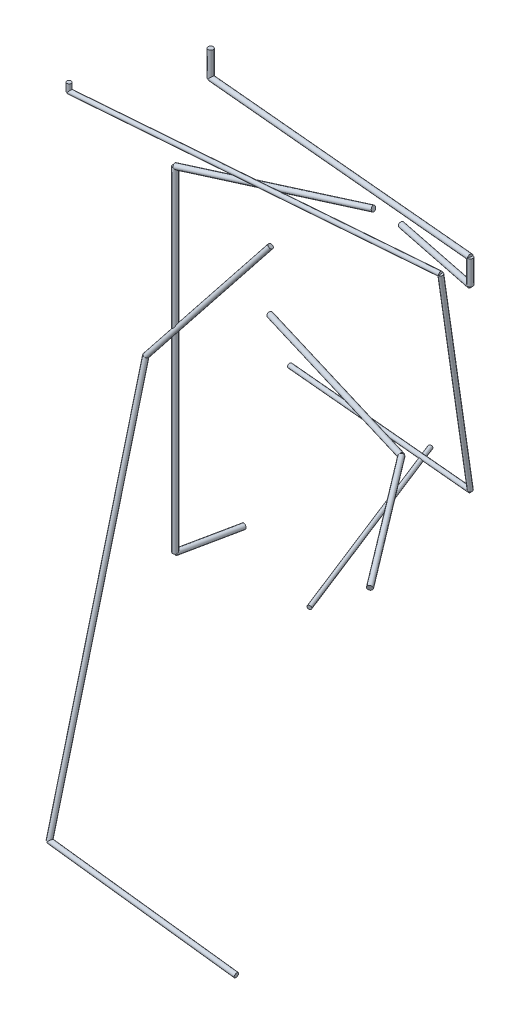
ISO-10303-21;
HEADER;
FILE_DESCRIPTION(('STEP AP214'),'2;1');
FILE_NAME('part.step','',(''),(''),'','','');
FILE_SCHEMA(('AUTOMOTIVE_DESIGN { 1 0 10303 214 1 1 1 1 }'));
ENDSEC;
DATA;
#1=APPLICATION_CONTEXT('core data for automotive mechanical design processes');
#2=APPLICATION_PROTOCOL_DEFINITION('international standard','automotive_design',2000,#1);
#3=PRODUCT_CONTEXT('',#1,'mechanical');
#4=PRODUCT('Part','Part','',(#3));
#5=PRODUCT_RELATED_PRODUCT_CATEGORY('part','',(#4));
#6=PRODUCT_DEFINITION_FORMATION('','',#4);
#7=PRODUCT_DEFINITION_CONTEXT('part definition',#1,'design');
#8=PRODUCT_DEFINITION('design','',#6,#7);
#9=PRODUCT_DEFINITION_SHAPE('','',#8);
#10=(LENGTH_UNIT() NAMED_UNIT(*) SI_UNIT(.MILLI.,.METRE.));
#11=(NAMED_UNIT(*) PLANE_ANGLE_UNIT() SI_UNIT($,.RADIAN.));
#12=(NAMED_UNIT(*) SI_UNIT($,.STERADIAN.) SOLID_ANGLE_UNIT());
#13=UNCERTAINTY_MEASURE_WITH_UNIT(LENGTH_MEASURE(1.E-05),#10,'distance_accuracy_value','');
#14=(GEOMETRIC_REPRESENTATION_CONTEXT(3) GLOBAL_UNCERTAINTY_ASSIGNED_CONTEXT((#13)) GLOBAL_UNIT_ASSIGNED_CONTEXT((#10,
#11,#12)) REPRESENTATION_CONTEXT('',''));
#15=CARTESIAN_POINT('',(0.,0.,0.));
#16=DIRECTION('',(0.,0.,1.));
#17=DIRECTION('',(1.,0.,0.));
#18=AXIS2_PLACEMENT_3D('',#15,#16,#17);
#19=CARTESIAN_POINT('',(60.,65.,75.));
#20=DIRECTION('',(0.934343594370381,0.0913498948317405,0.344466608502575));
#21=DIRECTION('',(0.345912919754059,0.,-0.938266620927773));
#22=AXIS2_PLACEMENT_3D('',#19,#20,#21);
#23=PLANE('',#22);
#24=CARTESIAN_POINT('',(60.,65.,75.));
#25=DIRECTION('',(-0.934343594370381,-0.0913498948317405,-0.344466608502575));
#26=DIRECTION('',(-0.345912919754059,0.,0.938266620927773));
#27=AXIS2_PLACEMENT_3D('',#24,#25,#26);
#28=CIRCLE('',#27,1.3);
#29=CARTESIAN_POINT('',(59.5503132043197,65.,76.2197466072061));
#30=VERTEX_POINT('',#29);
#31=EDGE_CURVE('P0_E10',#30,#30,#28,.T.);
#32=ORIENTED_EDGE('',*,*,#31,.F.);
#33=EDGE_LOOP('',(#32));
#34=FACE_BOUND('',#33,.T.);
#35=ADVANCED_FACE('P0_F15',(#34),#23,.T.);
#36=CARTESIAN_POINT('',(-45.785,54.6575,36.));
#37=DIRECTION('',(-0.934343594370381,-0.0913498948317405,-0.344466608502575));
#38=DIRECTION('',(-0.345912919754059,0.,0.938266620927773));
#39=AXIS2_PLACEMENT_3D('',#36,#37,#38);
#40=PLANE('',#39);
#41=CARTESIAN_POINT('',(-45.785,54.6575,36.));
#42=DIRECTION('',(0.934343594370381,0.0913498948317405,0.344466608502575));
#43=DIRECTION('',(0.345912919754059,0.,-0.938266620927773));
#44=AXIS2_PLACEMENT_3D('',#41,#42,#43);
#45=CIRCLE('',#44,1.3);
#46=CARTESIAN_POINT('',(-45.3353132043197,54.6575,34.7802533927939));
#47=VERTEX_POINT('',#46);
#48=EDGE_CURVE('P0_E22',#47,#47,#45,.T.);
#49=ORIENTED_EDGE('',*,*,#48,.F.);
#50=EDGE_LOOP('',(#49));
#51=FACE_BOUND('',#50,.T.);
#52=ADVANCED_FACE('P0_F26',(#51),#40,.T.);
#53=CARTESIAN_POINT('',(-45.785,54.6575,36.));
#54=DIRECTION('',(0.934343594370381,0.0913498948317405,0.344466608502575));
#55=DIRECTION('',(0.345912919754059,0.,-0.938266620927773));
#56=AXIS2_PLACEMENT_3D('',#53,#54,#55);
#57=CYLINDRICAL_SURFACE('',#56,1.3);
#58=ORIENTED_EDGE('',*,*,#31,.T.);
#59=EDGE_LOOP('',(#58));
#60=FACE_BOUND('',#59,.T.);
#61=ORIENTED_EDGE('',*,*,#48,.T.);
#62=EDGE_LOOP('',(#61));
#63=FACE_BOUND('',#62,.T.);
#64=ADVANCED_FACE('P0_F17',(#60,#63),#57,.T.);
#65=CLOSED_SHELL('',(#35,#52,#64));
#66=MANIFOLD_SOLID_BREP('P0_B1',#65);
#67=CARTESIAN_POINT('',(95.,49.8,126.));
#68=DIRECTION('',(0.549494562888099,-0.238637638739974,0.800692077351229));
#69=DIRECTION('',(0.824513352643803,0.,-0.565842496912414));
#70=AXIS2_PLACEMENT_3D('',#67,#68,#69);
#71=PLANE('',#70);
#72=CARTESIAN_POINT('',(95.,49.8,126.));
#73=DIRECTION('',(-0.549494562888099,0.238637638739974,-0.800692077351229));
#74=DIRECTION('',(-0.824513352643803,0.,0.565842496912414));
#75=AXIS2_PLACEMENT_3D('',#72,#73,#74);
#76=CIRCLE('',#75,1.3);
#77=CARTESIAN_POINT('',(93.9281326415631,49.8,126.735595245986));
#78=VERTEX_POINT('',#77);
#79=EDGE_CURVE('P1_E10',#78,#78,#76,.T.);
#80=ORIENTED_EDGE('',*,*,#79,.F.);
#81=EDGE_LOOP('',(#80));
#82=FACE_BOUND('',#81,.T.);
#83=ADVANCED_FACE('P1_F15',(#82),#71,.T.);
#84=CARTESIAN_POINT('',(60.,65.,75.));
#85=DIRECTION('',(-0.549494562888099,0.238637638739974,-0.800692077351229));
#86=DIRECTION('',(-0.824513352643803,0.,0.565842496912414));
#87=AXIS2_PLACEMENT_3D('',#84,#85,#86);
#88=PLANE('',#87);
#89=CARTESIAN_POINT('',(60.,65.,75.));
#90=DIRECTION('',(0.549494562888099,-0.238637638739974,0.800692077351229));
#91=DIRECTION('',(0.824513352643803,0.,-0.565842496912414));
#92=AXIS2_PLACEMENT_3D('',#89,#90,#91);
#93=CIRCLE('',#92,1.3);
#94=CARTESIAN_POINT('',(61.0718673584369,65.,74.2644047540139));
#95=VERTEX_POINT('',#94);
#96=EDGE_CURVE('P1_E22',#95,#95,#93,.T.);
#97=ORIENTED_EDGE('',*,*,#96,.F.);
#98=EDGE_LOOP('',(#97));
#99=FACE_BOUND('',#98,.T.);
#100=ADVANCED_FACE('P1_F26',(#99),#88,.T.);
#101=CARTESIAN_POINT('',(60.,65.,75.));
#102=DIRECTION('',(0.549494562888099,-0.238637638739974,0.800692077351229));
#103=DIRECTION('',(0.824513352643803,0.,-0.565842496912414));
#104=AXIS2_PLACEMENT_3D('',#101,#102,#103);
#105=CYLINDRICAL_SURFACE('',#104,1.3);
#106=ORIENTED_EDGE('',*,*,#79,.T.);
#107=EDGE_LOOP('',(#106));
#108=FACE_BOUND('',#107,.T.);
#109=ORIENTED_EDGE('',*,*,#96,.T.);
#110=EDGE_LOOP('',(#109));
#111=FACE_BOUND('',#110,.T.);
#112=ADVANCED_FACE('P1_F17',(#108,#111),#105,.T.);
#113=CLOSED_SHELL('',(#83,#100,#112));
#114=MANIFOLD_SOLID_BREP('P1_B1',#113);
#115=CARTESIAN_POINT('',(-90.,24.,55.));
#116=DIRECTION('',(-0.571423067947628,-0.783539512901037,0.24401128896042));
#117=DIRECTION('',(0.807962280591376,-0.589234209072745,0.));
#118=AXIS2_PLACEMENT_3D('',#115,#116,#117);
#119=PLANE('',#118);
#120=CARTESIAN_POINT('',(-90.,24.,55.));
#121=DIRECTION('',(0.571423067947628,0.783539512901037,-0.24401128896042));
#122=DIRECTION('',(-0.807962280591376,0.589234209072745,0.));
#123=AXIS2_PLACEMENT_3D('',#120,#121,#122);
#124=CIRCLE('',#123,1.2);
#125=CARTESIAN_POINT('',(-90.9695547367096,24.7070810508873,55.));
#126=VERTEX_POINT('',#125);
#127=EDGE_CURVE('P2_E10',#126,#126,#124,.T.);
#128=ORIENTED_EDGE('',*,*,#127,.F.);
#129=EDGE_LOOP('',(#128));
#130=FACE_BOUND('',#129,.T.);
#131=ADVANCED_FACE('P2_F15',(#130),#119,.T.);
#132=CARTESIAN_POINT('',(-45.506,85.0105,36.));
#133=DIRECTION('',(0.571423067947628,0.783539512901037,-0.24401128896042));
#134=DIRECTION('',(-0.807962280591376,0.589234209072745,0.));
#135=AXIS2_PLACEMENT_3D('',#132,#133,#134);
#136=PLANE('',#135);
#137=CARTESIAN_POINT('',(-45.506,85.0105,36.));
#138=DIRECTION('',(-0.571423067947628,-0.783539512901037,0.24401128896042));
#139=DIRECTION('',(0.807962280591376,-0.589234209072745,0.));
#140=AXIS2_PLACEMENT_3D('',#137,#138,#139);
#141=CIRCLE('',#140,1.2);
#142=CARTESIAN_POINT('',(-44.5364452632903,84.3034189491127,36.));
#143=VERTEX_POINT('',#142);
#144=EDGE_CURVE('P2_E22',#143,#143,#141,.T.);
#145=ORIENTED_EDGE('',*,*,#144,.F.);
#146=EDGE_LOOP('',(#145));
#147=FACE_BOUND('',#146,.T.);
#148=ADVANCED_FACE('P2_F26',(#147),#136,.T.);
#149=CARTESIAN_POINT('',(-45.506,85.0105,36.));
#150=DIRECTION('',(-0.571423067947628,-0.783539512901037,0.24401128896042));
#151=DIRECTION('',(0.807962280591376,-0.589234209072745,0.));
#152=AXIS2_PLACEMENT_3D('',#149,#150,#151);
#153=CYLINDRICAL_SURFACE('',#152,1.2);
#154=ORIENTED_EDGE('',*,*,#127,.T.);
#155=EDGE_LOOP('',(#154));
#156=FACE_BOUND('',#155,.T.);
#157=ORIENTED_EDGE('',*,*,#144,.T.);
#158=EDGE_LOOP('',(#157));
#159=FACE_BOUND('',#158,.T.);
#160=ADVANCED_FACE('P2_F17',(#156,#159),#153,.T.);
#161=CLOSED_SHELL('',(#131,#148,#160));
#162=MANIFOLD_SOLID_BREP('P2_B1',#161);
#163=CARTESIAN_POINT('',(-90.,-165.,104.));
#164=DIRECTION('',(0.,-0.967996898165801,0.250962158783726));
#165=DIRECTION('',(0.,-0.250962158783726,-0.967996898165801));
#166=AXIS2_PLACEMENT_3D('',#163,#164,#165);
#167=PLANE('',#166);
#168=CARTESIAN_POINT('',(-90.,-165.,104.));
#169=DIRECTION('',(0.,0.967996898165801,-0.250962158783726));
#170=DIRECTION('',(0.,0.250962158783726,0.967996898165801));
#171=AXIS2_PLACEMENT_3D('',#168,#169,#170);
#172=CIRCLE('',#171,1.2);
#173=CARTESIAN_POINT('',(-90.,-164.69884540946,105.161596277799));
#174=VERTEX_POINT('',#173);
#175=EDGE_CURVE('P3_E10',#174,#174,#172,.T.);
#176=ORIENTED_EDGE('',*,*,#175,.F.);
#177=EDGE_LOOP('',(#176));
#178=FACE_BOUND('',#177,.T.);
#179=ADVANCED_FACE('P3_F15',(#178),#167,.T.);
#180=CARTESIAN_POINT('',(-90.,24.,55.));
#181=DIRECTION('',(0.,0.967996898165801,-0.250962158783726));
#182=DIRECTION('',(0.,0.250962158783726,0.967996898165801));
#183=AXIS2_PLACEMENT_3D('',#180,#181,#182);
#184=PLANE('',#183);
#185=CARTESIAN_POINT('',(-90.,24.,55.));
#186=DIRECTION('',(0.,-0.967996898165801,0.250962158783726));
#187=DIRECTION('',(0.,-0.250962158783726,-0.967996898165801));
#188=AXIS2_PLACEMENT_3D('',#185,#186,#187);
#189=CIRCLE('',#188,1.2);
#190=CARTESIAN_POINT('',(-90.,23.6988454094595,53.838403722201));
#191=VERTEX_POINT('',#190);
#192=EDGE_CURVE('P3_E22',#191,#191,#189,.T.);
#193=ORIENTED_EDGE('',*,*,#192,.F.);
#194=EDGE_LOOP('',(#193));
#195=FACE_BOUND('',#194,.T.);
#196=ADVANCED_FACE('P3_F26',(#195),#184,.T.);
#197=CARTESIAN_POINT('',(-90.,24.,55.));
#198=DIRECTION('',(0.,-0.967996898165801,0.250962158783726));
#199=DIRECTION('',(0.,-0.250962158783726,-0.967996898165801));
#200=AXIS2_PLACEMENT_3D('',#197,#198,#199);
#201=CYLINDRICAL_SURFACE('',#200,1.2);
#202=ORIENTED_EDGE('',*,*,#175,.T.);
#203=EDGE_LOOP('',(#202));
#204=FACE_BOUND('',#203,.T.);
#205=ORIENTED_EDGE('',*,*,#192,.T.);
#206=EDGE_LOOP('',(#205));
#207=FACE_BOUND('',#206,.T.);
#208=ADVANCED_FACE('P3_F17',(#204,#207),#201,.T.);
#209=CLOSED_SHELL('',(#179,#196,#208));
#210=MANIFOLD_SOLID_BREP('P3_B1',#209);
#211=CARTESIAN_POINT('',(0.,-181.7888,98.9319));
#212=DIRECTION('',(0.981539529122375,-0.183098564961442,-0.0552726720838346));
#213=DIRECTION('',(0.183378896758705,0.983042308460607,0.));
#214=AXIS2_PLACEMENT_3D('',#211,#212,#213);
#215=PLANE('',#214);
#216=CARTESIAN_POINT('',(0.,-181.7888,98.9319));
#217=DIRECTION('',(-0.981539529122375,0.183098564961442,0.0552726720838346));
#218=DIRECTION('',(-0.183378896758705,-0.983042308460607,0.));
#219=AXIS2_PLACEMENT_3D('',#216,#217,#218);
#220=CIRCLE('',#219,1.2);
#221=CARTESIAN_POINT('',(-0.220054676110446,-182.968450770153,98.9319));
#222=VERTEX_POINT('',#221);
#223=EDGE_CURVE('P4_E10',#222,#222,#220,.T.);
#224=ORIENTED_EDGE('',*,*,#223,.F.);
#225=EDGE_LOOP('',(#224));
#226=FACE_BOUND('',#225,.T.);
#227=ADVANCED_FACE('P4_F15',(#226),#215,.T.);
#228=CARTESIAN_POINT('',(-90.,-165.,104.));
#229=DIRECTION('',(-0.981539529122375,0.183098564961442,0.0552726720838346));
#230=DIRECTION('',(-0.183378896758705,-0.983042308460607,0.));
#231=AXIS2_PLACEMENT_3D('',#228,#229,#230);
#232=PLANE('',#231);
#233=CARTESIAN_POINT('',(-90.,-165.,104.));
#234=DIRECTION('',(0.981539529122375,-0.183098564961442,-0.0552726720838346));
#235=DIRECTION('',(0.183378896758705,0.983042308460607,0.));
#236=AXIS2_PLACEMENT_3D('',#233,#234,#235);
#237=CIRCLE('',#236,1.2);
#238=CARTESIAN_POINT('',(-89.7799453238895,-163.820349229847,104.));
#239=VERTEX_POINT('',#238);
#240=EDGE_CURVE('P4_E22',#239,#239,#237,.T.);
#241=ORIENTED_EDGE('',*,*,#240,.F.);
#242=EDGE_LOOP('',(#241));
#243=FACE_BOUND('',#242,.T.);
#244=ADVANCED_FACE('P4_F26',(#243),#232,.T.);
#245=CARTESIAN_POINT('',(-90.,-165.,104.));
#246=DIRECTION('',(0.981539529122375,-0.183098564961442,-0.0552726720838346));
#247=DIRECTION('',(0.183378896758705,0.983042308460607,0.));
#248=AXIS2_PLACEMENT_3D('',#245,#246,#247);
#249=CYLINDRICAL_SURFACE('',#248,1.2);
#250=ORIENTED_EDGE('',*,*,#223,.T.);
#251=EDGE_LOOP('',(#250));
#252=FACE_BOUND('',#251,.T.);
#253=ORIENTED_EDGE('',*,*,#240,.T.);
#254=EDGE_LOOP('',(#253));
#255=FACE_BOUND('',#254,.T.);
#256=ADVANCED_FACE('P4_F17',(#252,#255),#249,.T.);
#257=CLOSED_SHELL('',(#227,#244,#256));
#258=MANIFOLD_SOLID_BREP('P4_B1',#257);
#259=CARTESIAN_POINT('',(-80.,110.,50.));
#260=DIRECTION('',(-0.967776189076592,-0.197538581162378,0.156165799100644));
#261=DIRECTION('',(0.199992315754458,-0.979797465621936,0.));
#262=AXIS2_PLACEMENT_3D('',#259,#260,#261);
#263=PLANE('',#262);
#264=CARTESIAN_POINT('',(-80.,110.,50.));
#265=DIRECTION('',(0.967776189076592,0.197538581162378,-0.156165799100644));
#266=DIRECTION('',(-0.199992315754458,0.979797465621936,0.));
#267=AXIS2_PLACEMENT_3D('',#264,#265,#266);
#268=CIRCLE('',#267,1.3);
#269=CARTESIAN_POINT('',(-80.2599900104808,111.273736705309,50.));
#270=VERTEX_POINT('',#269);
#271=EDGE_CURVE('P5_E10',#270,#270,#268,.T.);
#272=ORIENTED_EDGE('',*,*,#271,.F.);
#273=EDGE_LOOP('',(#272));
#274=FACE_BOUND('',#273,.T.);
#275=ADVANCED_FACE('P5_F15',(#274),#263,.T.);
#276=CARTESIAN_POINT('',(6.7595,127.709,36.));
#277=DIRECTION('',(0.967776189076592,0.197538581162378,-0.156165799100644));
#278=DIRECTION('',(-0.199992315754458,0.979797465621936,0.));
#279=AXIS2_PLACEMENT_3D('',#276,#277,#278);
#280=PLANE('',#279);
#281=CARTESIAN_POINT('',(6.7595,127.709,36.));
#282=DIRECTION('',(-0.967776189076592,-0.197538581162378,0.156165799100644));
#283=DIRECTION('',(0.199992315754458,-0.979797465621936,0.));
#284=AXIS2_PLACEMENT_3D('',#281,#282,#283);
#285=CIRCLE('',#284,1.3);
#286=CARTESIAN_POINT('',(7.0194900104808,126.435263294692,36.));
#287=VERTEX_POINT('',#286);
#288=EDGE_CURVE('P5_E22',#287,#287,#285,.T.);
#289=ORIENTED_EDGE('',*,*,#288,.F.);
#290=EDGE_LOOP('',(#289));
#291=FACE_BOUND('',#290,.T.);
#292=ADVANCED_FACE('P5_F26',(#291),#280,.T.);
#293=CARTESIAN_POINT('',(6.7595,127.709,36.));
#294=DIRECTION('',(-0.967776189076592,-0.197538581162378,0.156165799100644));
#295=DIRECTION('',(0.199992315754458,-0.979797465621936,0.));
#296=AXIS2_PLACEMENT_3D('',#293,#294,#295);
#297=CYLINDRICAL_SURFACE('',#296,1.3);
#298=ORIENTED_EDGE('',*,*,#271,.T.);
#299=EDGE_LOOP('',(#298));
#300=FACE_BOUND('',#299,.T.);
#301=ORIENTED_EDGE('',*,*,#288,.T.);
#302=EDGE_LOOP('',(#301));
#303=FACE_BOUND('',#302,.T.);
#304=ADVANCED_FACE('P5_F17',(#300,#303),#297,.T.);
#305=CLOSED_SHELL('',(#275,#292,#304));
#306=MANIFOLD_SOLID_BREP('P5_B1',#305);
#307=CARTESIAN_POINT('',(-80.,-60.,50.));
#308=DIRECTION('',(0.,-1.,0.));
#309=DIRECTION('',(0.,0.,-1.));
#310=AXIS2_PLACEMENT_3D('',#307,#308,#309);
#311=PLANE('',#310);
#312=CARTESIAN_POINT('',(-80.,-60.,50.));
#313=DIRECTION('',(0.,1.,0.));
#314=DIRECTION('',(0.,0.,1.));
#315=AXIS2_PLACEMENT_3D('',#312,#313,#314);
#316=CIRCLE('',#315,1.3);
#317=CARTESIAN_POINT('',(-80.,-60.,51.3));
#318=VERTEX_POINT('',#317);
#319=EDGE_CURVE('P6_E10',#318,#318,#316,.T.);
#320=ORIENTED_EDGE('',*,*,#319,.F.);
#321=EDGE_LOOP('',(#320));
#322=FACE_BOUND('',#321,.T.);
#323=ADVANCED_FACE('P6_F15',(#322),#311,.T.);
#324=CARTESIAN_POINT('',(-80.,110.,50.));
#325=DIRECTION('',(0.,1.,0.));
#326=DIRECTION('',(0.,0.,1.));
#327=AXIS2_PLACEMENT_3D('',#324,#325,#326);
#328=PLANE('',#327);
#329=CARTESIAN_POINT('',(-80.,110.,50.));
#330=DIRECTION('',(0.,-1.,0.));
#331=DIRECTION('',(0.,0.,-1.));
#332=AXIS2_PLACEMENT_3D('',#329,#330,#331);
#333=CIRCLE('',#332,1.3);
#334=CARTESIAN_POINT('',(-80.,110.,48.7));
#335=VERTEX_POINT('',#334);
#336=EDGE_CURVE('P6_E22',#335,#335,#333,.T.);
#337=ORIENTED_EDGE('',*,*,#336,.F.);
#338=EDGE_LOOP('',(#337));
#339=FACE_BOUND('',#338,.T.);
#340=ADVANCED_FACE('P6_F26',(#339),#328,.T.);
#341=CARTESIAN_POINT('',(-80.,110.,50.));
#342=DIRECTION('',(0.,-1.,0.));
#343=DIRECTION('',(0.,0.,-1.));
#344=AXIS2_PLACEMENT_3D('',#341,#342,#343);
#345=CYLINDRICAL_SURFACE('',#344,1.3);
#346=ORIENTED_EDGE('',*,*,#319,.T.);
#347=EDGE_LOOP('',(#346));
#348=FACE_BOUND('',#347,.T.);
#349=ORIENTED_EDGE('',*,*,#336,.T.);
#350=EDGE_LOOP('',(#349));
#351=FACE_BOUND('',#350,.T.);
#352=ADVANCED_FACE('P6_F17',(#348,#351),#345,.T.);
#353=CLOSED_SHELL('',(#323,#340,#352));
#354=MANIFOLD_SOLID_BREP('P6_B1',#353);
#355=CARTESIAN_POINT('',(-74.,-60.,21.));
#356=DIRECTION('',(0.202605604035952,0.,-0.979260419507103));
#357=DIRECTION('',(-0.979260419507103,0.,-0.202605604035952));
#358=AXIS2_PLACEMENT_3D('',#355,#356,#357);
#359=PLANE('',#358);
#360=CARTESIAN_POINT('',(-74.,-60.,21.));
#361=DIRECTION('',(-0.202605604035952,0.,0.979260419507103));
#362=DIRECTION('',(0.979260419507103,0.,0.202605604035952));
#363=AXIS2_PLACEMENT_3D('',#360,#361,#362);
#364=CIRCLE('',#363,1.3);
#365=CARTESIAN_POINT('',(-72.7269614546408,-60.,21.2633872852467));
#366=VERTEX_POINT('',#365);
#367=EDGE_CURVE('P7_E10',#366,#366,#364,.T.);
#368=ORIENTED_EDGE('',*,*,#367,.F.);
#369=EDGE_LOOP('',(#368));
#370=FACE_BOUND('',#369,.T.);
#371=ADVANCED_FACE('P7_F15',(#370),#359,.T.);
#372=CARTESIAN_POINT('',(-80.,-60.,50.));
#373=DIRECTION('',(-0.202605604035952,0.,0.979260419507103));
#374=DIRECTION('',(0.979260419507103,0.,0.202605604035952));
#375=AXIS2_PLACEMENT_3D('',#372,#373,#374);
#376=PLANE('',#375);
#377=CARTESIAN_POINT('',(-80.,-60.,50.));
#378=DIRECTION('',(0.202605604035952,0.,-0.979260419507103));
#379=DIRECTION('',(-0.979260419507103,0.,-0.202605604035952));
#380=AXIS2_PLACEMENT_3D('',#377,#378,#379);
#381=CIRCLE('',#380,1.3);
#382=CARTESIAN_POINT('',(-81.2730385453592,-60.,49.7366127147533));
#383=VERTEX_POINT('',#382);
#384=EDGE_CURVE('P7_E22',#383,#383,#381,.T.);
#385=ORIENTED_EDGE('',*,*,#384,.F.);
#386=EDGE_LOOP('',(#385));
#387=FACE_BOUND('',#386,.T.);
#388=ADVANCED_FACE('P7_F26',(#387),#376,.T.);
#389=CARTESIAN_POINT('',(-80.,-60.,50.));
#390=DIRECTION('',(0.202605604035952,0.,-0.979260419507103));
#391=DIRECTION('',(-0.979260419507103,0.,-0.202605604035952));
#392=AXIS2_PLACEMENT_3D('',#389,#390,#391);
#393=CYLINDRICAL_SURFACE('',#392,1.3);
#394=ORIENTED_EDGE('',*,*,#367,.T.);
#395=EDGE_LOOP('',(#394));
#396=FACE_BOUND('',#395,.T.);
#397=ORIENTED_EDGE('',*,*,#384,.T.);
#398=EDGE_LOOP('',(#397));
#399=FACE_BOUND('',#398,.T.);
#400=ADVANCED_FACE('P7_F17',(#396,#399),#393,.T.);
#401=CLOSED_SHELL('',(#371,#388,#400));
#402=MANIFOLD_SOLID_BREP('P7_B1',#401);
#403=CARTESIAN_POINT('',(65.,127.709,45.));
#404=DIRECTION('',(0.979788503665346,0.,0.200036216933888));
#405=DIRECTION('',(0.200036216933888,0.,-0.979788503665347));
#406=AXIS2_PLACEMENT_3D('',#403,#404,#405);
#407=PLANE('',#406);
#408=CARTESIAN_POINT('',(65.,127.709,45.));
#409=DIRECTION('',(-0.979788503665346,0.,-0.200036216933888));
#410=DIRECTION('',(-0.200036216933888,0.,0.979788503665347));
#411=AXIS2_PLACEMENT_3D('',#408,#409,#410);
#412=CIRCLE('',#411,1.3);
#413=CARTESIAN_POINT('',(65.2600470820141,127.709,43.726274945235));
#414=VERTEX_POINT('',#413);
#415=EDGE_CURVE('P8_E10',#414,#414,#412,.T.);
#416=ORIENTED_EDGE('',*,*,#415,.F.);
#417=EDGE_LOOP('',(#416));
#418=FACE_BOUND('',#417,.T.);
#419=ADVANCED_FACE('P8_F15',(#418),#407,.T.);
#420=CARTESIAN_POINT('',(20.9175,127.709,36.));
#421=DIRECTION('',(-0.979788503665346,0.,-0.200036216933888));
#422=DIRECTION('',(-0.200036216933888,0.,0.979788503665347));
#423=AXIS2_PLACEMENT_3D('',#420,#421,#422);
#424=PLANE('',#423);
#425=CARTESIAN_POINT('',(20.9175,127.709,36.));
#426=DIRECTION('',(0.979788503665346,0.,0.200036216933888));
#427=DIRECTION('',(0.200036216933888,0.,-0.979788503665347));
#428=AXIS2_PLACEMENT_3D('',#425,#426,#427);
#429=CIRCLE('',#428,1.3);
#430=CARTESIAN_POINT('',(21.1775470820141,127.709,34.726274945235));
#431=VERTEX_POINT('',#430);
#432=EDGE_CURVE('P8_E22',#431,#431,#429,.T.);
#433=ORIENTED_EDGE('',*,*,#432,.F.);
#434=EDGE_LOOP('',(#433));
#435=FACE_BOUND('',#434,.T.);
#436=ADVANCED_FACE('P8_F26',(#435),#424,.T.);
#437=CARTESIAN_POINT('',(20.9175,127.709,36.));
#438=DIRECTION('',(0.979788503665346,0.,0.200036216933888));
#439=DIRECTION('',(0.200036216933888,0.,-0.979788503665347));
#440=AXIS2_PLACEMENT_3D('',#437,#438,#439);
#441=CYLINDRICAL_SURFACE('',#440,1.3);
#442=CARTESIAN_POINT('',(65.2600470820141,127.709,43.726274945235));
#443=CARTESIAN_POINT('',(64.8008543736807,127.709,43.632524945235));
#444=CARTESIAN_POINT('',(64.3416616653474,127.709,43.5387749452351));
#445=CARTESIAN_POINT('',(63.4232762486807,127.709,43.351274945235));
#446=CARTESIAN_POINT('',(62.9640835403474,127.709,43.257524945235));
#447=CARTESIAN_POINT('',(62.0456981236807,127.709,43.070024945235));
#448=CARTESIAN_POINT('',(61.5865054153474,127.709,42.9762749452351));
#449=CARTESIAN_POINT('',(60.6681199986807,127.709,42.788774945235));
#450=CARTESIAN_POINT('',(60.2089272903474,127.709,42.695024945235));
#451=CARTESIAN_POINT('',(59.2905418736807,127.709,42.507524945235));
#452=CARTESIAN_POINT('',(58.8313491653474,127.709,42.413774945235));
#453=CARTESIAN_POINT('',(57.9129637486807,127.709,42.226274945235));
#454=CARTESIAN_POINT('',(57.4537710403474,127.709,42.132524945235));
#455=CARTESIAN_POINT('',(56.5353856236807,127.709,41.945024945235));
#456=CARTESIAN_POINT('',(56.0761929153474,127.709,41.851274945235));
#457=CARTESIAN_POINT('',(55.1578074986807,127.709,41.663774945235));
#458=CARTESIAN_POINT('',(54.6986147903474,127.709,41.570024945235));
#459=CARTESIAN_POINT('',(53.7802293736807,127.709,41.382524945235));
#460=CARTESIAN_POINT('',(53.3210366653474,127.709,41.288774945235));
#461=CARTESIAN_POINT('',(52.4026512486807,127.709,41.101274945235));
#462=CARTESIAN_POINT('',(51.9434585403474,127.709,41.007524945235));
#463=CARTESIAN_POINT('',(51.0250731236807,127.709,40.820024945235));
#464=CARTESIAN_POINT('',(50.5658804153474,127.709,40.726274945235));
#465=CARTESIAN_POINT('',(49.6474949986807,127.709,40.538774945235));
#466=CARTESIAN_POINT('',(49.1883022903474,127.709,40.445024945235));
#467=CARTESIAN_POINT('',(48.2699168736807,127.709,40.257524945235));
#468=CARTESIAN_POINT('',(47.8107241653474,127.709,40.163774945235));
#469=CARTESIAN_POINT('',(46.8923387486807,127.709,39.976274945235));
#470=CARTESIAN_POINT('',(46.4331460403474,127.709,39.882524945235));
#471=CARTESIAN_POINT('',(45.5147606236807,127.709,39.695024945235));
#472=CARTESIAN_POINT('',(45.0555679153474,127.709,39.601274945235));
#473=CARTESIAN_POINT('',(44.1371824986807,127.709,39.413774945235));
#474=CARTESIAN_POINT('',(43.6779897903474,127.709,39.3200249452351));
#475=CARTESIAN_POINT('',(42.7596043736807,127.709,39.132524945235));
#476=CARTESIAN_POINT('',(42.3004116653474,127.709,39.038774945235));
#477=CARTESIAN_POINT('',(41.3820262486807,127.709,38.851274945235));
#478=CARTESIAN_POINT('',(40.9228335403474,127.709,38.7575249452351));
#479=CARTESIAN_POINT('',(40.0044481236807,127.709,38.570024945235));
#480=CARTESIAN_POINT('',(39.5452554153474,127.709,38.476274945235));
#481=CARTESIAN_POINT('',(38.6268699986807,127.709,38.288774945235));
#482=CARTESIAN_POINT('',(38.1676772903474,127.709,38.195024945235));
#483=CARTESIAN_POINT('',(37.2492918736807,127.709,38.007524945235));
#484=CARTESIAN_POINT('',(36.7900991653474,127.709,37.913774945235));
#485=CARTESIAN_POINT('',(35.8717137486807,127.709,37.726274945235));
#486=CARTESIAN_POINT('',(35.4125210403474,127.709,37.632524945235));
#487=CARTESIAN_POINT('',(34.4941356236807,127.709,37.445024945235));
#488=CARTESIAN_POINT('',(34.0349429153474,127.709,37.351274945235));
#489=CARTESIAN_POINT('',(33.1165574986807,127.709,37.163774945235));
#490=CARTESIAN_POINT('',(32.6573647903474,127.709,37.070024945235));
#491=CARTESIAN_POINT('',(31.7389793736807,127.709,36.882524945235));
#492=CARTESIAN_POINT('',(31.2797866653474,127.709,36.788774945235));
#493=CARTESIAN_POINT('',(30.3614012486807,127.709,36.601274945235));
#494=CARTESIAN_POINT('',(29.9022085403474,127.709,36.507524945235));
#495=CARTESIAN_POINT('',(28.9838231236807,127.709,36.320024945235));
#496=CARTESIAN_POINT('',(28.5246304153474,127.709,36.226274945235));
#497=CARTESIAN_POINT('',(27.6062449986807,127.709,36.038774945235));
#498=CARTESIAN_POINT('',(27.1470522903474,127.709,35.945024945235));
#499=CARTESIAN_POINT('',(26.2286668736807,127.709,35.757524945235));
#500=CARTESIAN_POINT('',(25.7694741653474,127.709,35.663774945235));
#501=CARTESIAN_POINT('',(24.8510887486807,127.709,35.476274945235));
#502=CARTESIAN_POINT('',(24.3918960403474,127.709,35.382524945235));
#503=CARTESIAN_POINT('',(23.4735106236807,127.709,35.195024945235));
#504=CARTESIAN_POINT('',(23.0143179153474,127.709,35.101274945235));
#505=CARTESIAN_POINT('',(22.0959324986807,127.709,34.913774945235));
#506=CARTESIAN_POINT('',(21.6367397903474,127.709,34.820024945235));
#507=CARTESIAN_POINT('',(21.1775470820141,127.709,34.726274945235));
#508=B_SPLINE_CURVE_WITH_KNOTS('',3,(#442,#443,#444,#445,#446,#447,#448,#449,#450,#451,#452,
#453,#454,#455,#456,#457,#458,#459,#460,#461,#462,#463,#464,#465,#466,#467,#468,#469,#470,#471,
#472,#473,#474,#475,#476,#477,#478,#479,#480,#481,#482,#483,#484,#485,#486,#487,#488,#489,#490,
#491,#492,#493,#494,#495,#496,#497,#498,#499,#500,#501,#502,#503,#504,#505,#506,#507),
.UNSPECIFIED.,.F.,.F.,(4,2,2,2,2,2,2,2,2,2,2,2,2,2,2,2,2,2,2,2,2,2,2,2,2,2,2,2,2,2,2,2,4),(0.,
1.40599539578852,2.81199079157704,4.21798618736556,5.62398158315408,7.0299769789426,
8.43597237473112,9.84196777051964,11.2479631663082,12.6539585620967,14.0599539578852,
15.4659493536737,16.8719447494622,18.2779401452508,19.6839355410393,21.0899309368278,
22.4959263326163,23.9019217284048,25.3079171241934,26.7139125199819,28.1199079157704,
29.5259033115589,30.9318987073474,32.337894103136,33.7438894989245,35.149884894713,
36.5558802905015,37.96187568629,39.3678710820786,40.7738664778671,42.1798618736556,
43.5858572694441,44.9918526652326),.UNSPECIFIED.);
#509=EDGE_CURVE('P8_BSEAM17',#414,#431,#508,.T.);
#510=ORIENTED_EDGE('',*,*,#415,.T.);
#511=ORIENTED_EDGE('',*,*,#432,.T.);
#512=ORIENTED_EDGE('',*,*,#509,.T.);
#513=ORIENTED_EDGE('',*,*,#509,.F.);
#514=EDGE_LOOP('',(#510,#512,#511,#513));
#515=FACE_BOUND('',#514,.T.);
#516=ADVANCED_FACE('P8_F17',(#515),#441,.T.);
#517=CLOSED_SHELL('',(#419,#436,#516));
#518=MANIFOLD_SOLID_BREP('P8_B1',#517);
#519=CARTESIAN_POINT('',(65.,140.,45.));
#520=DIRECTION('',(0.,1.,0.));
#521=DIRECTION('',(0.,0.,1.));
#522=AXIS2_PLACEMENT_3D('',#519,#520,#521);
#523=PLANE('',#522);
#524=CARTESIAN_POINT('',(65.,140.,45.));
#525=DIRECTION('',(0.,-1.,0.));
#526=DIRECTION('',(0.,0.,-1.));
#527=AXIS2_PLACEMENT_3D('',#524,#525,#526);
#528=CIRCLE('',#527,1.3);
#529=CARTESIAN_POINT('',(65.,140.,43.7));
#530=VERTEX_POINT('',#529);
#531=EDGE_CURVE('P9_E10',#530,#530,#528,.T.);
#532=ORIENTED_EDGE('',*,*,#531,.F.);
#533=EDGE_LOOP('',(#532));
#534=FACE_BOUND('',#533,.T.);
#535=ADVANCED_FACE('P9_F15',(#534),#523,.T.);
#536=CARTESIAN_POINT('',(65.,127.709,45.));
#537=DIRECTION('',(0.,-1.,0.));
#538=DIRECTION('',(0.,0.,-1.));
#539=AXIS2_PLACEMENT_3D('',#536,#537,#538);
#540=PLANE('',#539);
#541=CARTESIAN_POINT('',(65.,127.709,45.));
#542=DIRECTION('',(0.,1.,0.));
#543=DIRECTION('',(0.,0.,1.));
#544=AXIS2_PLACEMENT_3D('',#541,#542,#543);
#545=CIRCLE('',#544,1.3);
#546=CARTESIAN_POINT('',(65.,127.709,46.3));
#547=VERTEX_POINT('',#546);
#548=EDGE_CURVE('P9_E22',#547,#547,#545,.T.);
#549=ORIENTED_EDGE('',*,*,#548,.F.);
#550=EDGE_LOOP('',(#549));
#551=FACE_BOUND('',#550,.T.);
#552=ADVANCED_FACE('P9_F26',(#551),#540,.T.);
#553=CARTESIAN_POINT('',(65.,127.709,45.));
#554=DIRECTION('',(0.,1.,0.));
#555=DIRECTION('',(0.,0.,1.));
#556=AXIS2_PLACEMENT_3D('',#553,#554,#555);
#557=CYLINDRICAL_SURFACE('',#556,1.3);
#558=ORIENTED_EDGE('',*,*,#531,.T.);
#559=EDGE_LOOP('',(#558));
#560=FACE_BOUND('',#559,.T.);
#561=ORIENTED_EDGE('',*,*,#548,.T.);
#562=EDGE_LOOP('',(#561));
#563=FACE_BOUND('',#562,.T.);
#564=ADVANCED_FACE('P9_F17',(#560,#563),#557,.T.);
#565=CLOSED_SHELL('',(#535,#552,#564));
#566=MANIFOLD_SOLID_BREP('P9_B1',#565);
#567=CARTESIAN_POINT('',(-80.,140.,32.));
#568=DIRECTION('',(-0.996005042711685,0.,-0.0892970038293235));
#569=DIRECTION('',(-0.0892970038293235,0.,0.996005042711685));
#570=AXIS2_PLACEMENT_3D('',#567,#568,#569);
#571=PLANE('',#570);
#572=CARTESIAN_POINT('',(-80.,140.,32.));
#573=DIRECTION('',(0.996005042711685,0.,0.0892970038293235));
#574=DIRECTION('',(0.0892970038293235,0.,-0.996005042711685));
#575=AXIS2_PLACEMENT_3D('',#572,#573,#574);
#576=CIRCLE('',#575,1.3);
#577=CARTESIAN_POINT('',(-79.8839138950219,140.,30.7051934444748));
#578=VERTEX_POINT('',#577);
#579=EDGE_CURVE('P10_E10',#578,#578,#576,.T.);
#580=ORIENTED_EDGE('',*,*,#579,.F.);
#581=EDGE_LOOP('',(#580));
#582=FACE_BOUND('',#581,.T.);
#583=ADVANCED_FACE('P10_F15',(#582),#571,.T.);
#584=CARTESIAN_POINT('',(65.,140.,45.));
#585=DIRECTION('',(0.996005042711685,0.,0.0892970038293235));
#586=DIRECTION('',(0.0892970038293235,0.,-0.996005042711685));
#587=AXIS2_PLACEMENT_3D('',#584,#585,#586);
#588=PLANE('',#587);
#589=CARTESIAN_POINT('',(65.,140.,45.));
#590=DIRECTION('',(-0.996005042711685,0.,-0.0892970038293235));
#591=DIRECTION('',(-0.0892970038293235,0.,0.996005042711685));
#592=AXIS2_PLACEMENT_3D('',#589,#590,#591);
#593=CIRCLE('',#592,1.3);
#594=CARTESIAN_POINT('',(64.8839138950219,140.,46.2948065555252));
#595=VERTEX_POINT('',#594);
#596=EDGE_CURVE('P10_E22',#595,#595,#593,.T.);
#597=ORIENTED_EDGE('',*,*,#596,.F.);
#598=EDGE_LOOP('',(#597));
#599=FACE_BOUND('',#598,.T.);
#600=ADVANCED_FACE('P10_F26',(#599),#588,.T.);
#601=CARTESIAN_POINT('',(65.,140.,45.));
#602=DIRECTION('',(-0.996005042711685,0.,-0.0892970038293235));
#603=DIRECTION('',(-0.0892970038293235,0.,0.996005042711685));
#604=AXIS2_PLACEMENT_3D('',#601,#602,#603);
#605=CYLINDRICAL_SURFACE('',#604,1.3);
#606=ORIENTED_EDGE('',*,*,#579,.T.);
#607=EDGE_LOOP('',(#606));
#608=FACE_BOUND('',#607,.T.);
#609=ORIENTED_EDGE('',*,*,#596,.T.);
#610=EDGE_LOOP('',(#609));
#611=FACE_BOUND('',#610,.T.);
#612=ADVANCED_FACE('P10_F17',(#608,#611),#605,.T.);
#613=CLOSED_SHELL('',(#583,#600,#612));
#614=MANIFOLD_SOLID_BREP('P10_B1',#613);
#615=CARTESIAN_POINT('',(-80.,153.,32.));
#616=DIRECTION('',(0.,1.,0.));
#617=DIRECTION('',(0.,0.,1.));
#618=AXIS2_PLACEMENT_3D('',#615,#616,#617);
#619=PLANE('',#618);
#620=CARTESIAN_POINT('',(-80.,153.,32.));
#621=DIRECTION('',(0.,-1.,0.));
#622=DIRECTION('',(0.,0.,-1.));
#623=AXIS2_PLACEMENT_3D('',#620,#621,#622);
#624=CIRCLE('',#623,1.3);
#625=CARTESIAN_POINT('',(-80.,153.,30.7));
#626=VERTEX_POINT('',#625);
#627=EDGE_CURVE('P11_E10',#626,#626,#624,.T.);
#628=ORIENTED_EDGE('',*,*,#627,.F.);
#629=EDGE_LOOP('',(#628));
#630=FACE_BOUND('',#629,.T.);
#631=ADVANCED_FACE('P11_F15',(#630),#619,.T.);
#632=CARTESIAN_POINT('',(-80.,140.,32.));
#633=DIRECTION('',(0.,-1.,0.));
#634=DIRECTION('',(0.,0.,-1.));
#635=AXIS2_PLACEMENT_3D('',#632,#633,#634);
#636=PLANE('',#635);
#637=CARTESIAN_POINT('',(-80.,140.,32.));
#638=DIRECTION('',(0.,1.,0.));
#639=DIRECTION('',(0.,0.,1.));
#640=AXIS2_PLACEMENT_3D('',#637,#638,#639);
#641=CIRCLE('',#640,1.3);
#642=CARTESIAN_POINT('',(-80.,140.,33.3));
#643=VERTEX_POINT('',#642);
#644=EDGE_CURVE('P11_E22',#643,#643,#641,.T.);
#645=ORIENTED_EDGE('',*,*,#644,.F.);
#646=EDGE_LOOP('',(#645));
#647=FACE_BOUND('',#646,.T.);
#648=ADVANCED_FACE('P11_F26',(#647),#636,.T.);
#649=CARTESIAN_POINT('',(-80.,140.,32.));
#650=DIRECTION('',(0.,1.,0.));
#651=DIRECTION('',(0.,0.,1.));
#652=AXIS2_PLACEMENT_3D('',#649,#650,#651);
#653=CYLINDRICAL_SURFACE('',#652,1.3);
#654=ORIENTED_EDGE('',*,*,#627,.T.);
#655=EDGE_LOOP('',(#654));
#656=FACE_BOUND('',#655,.T.);
#657=ORIENTED_EDGE('',*,*,#644,.T.);
#658=EDGE_LOOP('',(#657));
#659=FACE_BOUND('',#658,.T.);
#660=ADVANCED_FACE('P11_F17',(#656,#659),#653,.T.);
#661=CLOSED_SHELL('',(#631,#648,#660));
#662=MANIFOLD_SOLID_BREP('P11_B1',#661);
#663=CARTESIAN_POINT('',(65.,37.359,45.));
#664=DIRECTION('',(0.996031406729212,0.,0.0890024539494627));
#665=DIRECTION('',(0.0890024539494627,0.,-0.996031406729212));
#666=AXIS2_PLACEMENT_3D('',#663,#664,#665);
#667=PLANE('',#666);
#668=CARTESIAN_POINT('',(65.,37.359,45.));
#669=DIRECTION('',(-0.996031406729212,0.,-0.0890024539494627));
#670=DIRECTION('',(-0.0890024539494627,0.,0.996031406729212));
#671=AXIS2_PLACEMENT_3D('',#668,#669,#670);
#672=CIRCLE('',#671,1.1);
#673=CARTESIAN_POINT('',(64.9020973006556,37.359,46.0956345474021));
#674=VERTEX_POINT('',#673);
#675=EDGE_CURVE('P12_E10',#674,#674,#672,.T.);
#676=ORIENTED_EDGE('',*,*,#675,.F.);
#677=EDGE_LOOP('',(#676));
#678=FACE_BOUND('',#677,.T.);
#679=ADVANCED_FACE('P12_F15',(#678),#667,.T.);
#680=CARTESIAN_POINT('',(-35.7195,37.359,36.));
#681=DIRECTION('',(-0.996031406729212,0.,-0.0890024539494627));
#682=DIRECTION('',(-0.0890024539494627,0.,0.996031406729212));
#683=AXIS2_PLACEMENT_3D('',#680,#681,#682);
#684=PLANE('',#683);
#685=CARTESIAN_POINT('',(-35.7195,37.359,36.));
#686=DIRECTION('',(0.996031406729212,0.,0.0890024539494627));
#687=DIRECTION('',(0.0890024539494627,0.,-0.996031406729212));
#688=AXIS2_PLACEMENT_3D('',#685,#686,#687);
#689=CIRCLE('',#688,1.1);
#690=CARTESIAN_POINT('',(-35.6215973006556,37.359,34.9043654525979));
#691=VERTEX_POINT('',#690);
#692=EDGE_CURVE('P12_E22',#691,#691,#689,.T.);
#693=ORIENTED_EDGE('',*,*,#692,.F.);
#694=EDGE_LOOP('',(#693));
#695=FACE_BOUND('',#694,.T.);
#696=ADVANCED_FACE('P12_F26',(#695),#684,.T.);
#697=CARTESIAN_POINT('',(-35.7195,37.359,36.));
#698=DIRECTION('',(0.996031406729212,0.,0.0890024539494627));
#699=DIRECTION('',(0.0890024539494627,0.,-0.996031406729212));
#700=AXIS2_PLACEMENT_3D('',#697,#698,#699);
#701=CYLINDRICAL_SURFACE('',#700,1.1);
#702=ORIENTED_EDGE('',*,*,#675,.T.);
#703=EDGE_LOOP('',(#702));
#704=FACE_BOUND('',#703,.T.);
#705=ORIENTED_EDGE('',*,*,#692,.T.);
#706=EDGE_LOOP('',(#705));
#707=FACE_BOUND('',#706,.T.);
#708=ADVANCED_FACE('P12_F17',(#704,#707),#701,.T.);
#709=CLOSED_SHELL('',(#679,#696,#708));
#710=MANIFOLD_SOLID_BREP('P12_B1',#709);
#711=CARTESIAN_POINT('',(65.,140.,60.));
#712=DIRECTION('',(0.,0.989489544758186,0.144604428750429));
#713=DIRECTION('',(0.,-0.144604428750429,0.989489544758186));
#714=AXIS2_PLACEMENT_3D('',#711,#712,#713);
#715=PLANE('',#714);
#716=CARTESIAN_POINT('',(65.,140.,60.));
#717=DIRECTION('',(0.,-0.989489544758186,-0.144604428750429));
#718=DIRECTION('',(0.,0.144604428750429,-0.989489544758186));
#719=AXIS2_PLACEMENT_3D('',#716,#717,#718);
#720=CIRCLE('',#719,1.1);
#721=CARTESIAN_POINT('',(65.,140.159064871626,58.911561500766));
#722=VERTEX_POINT('',#721);
#723=EDGE_CURVE('P13_E10',#722,#722,#720,.T.);
#724=ORIENTED_EDGE('',*,*,#723,.F.);
#725=EDGE_LOOP('',(#724));
#726=FACE_BOUND('',#725,.T.);
#727=ADVANCED_FACE('P13_F15',(#726),#715,.T.);
#728=CARTESIAN_POINT('',(65.,37.359,45.));
#729=DIRECTION('',(0.,-0.989489544758186,-0.144604428750429));
#730=DIRECTION('',(0.,0.144604428750429,-0.989489544758186));
#731=AXIS2_PLACEMENT_3D('',#728,#729,#730);
#732=PLANE('',#731);
#733=CARTESIAN_POINT('',(65.,37.359,45.));
#734=DIRECTION('',(0.,0.989489544758186,0.144604428750429));
#735=DIRECTION('',(0.,-0.144604428750429,0.989489544758186));
#736=AXIS2_PLACEMENT_3D('',#733,#734,#735);
#737=CIRCLE('',#736,1.1);
#738=CARTESIAN_POINT('',(65.,37.1999351283745,46.088438499234));
#739=VERTEX_POINT('',#738);
#740=EDGE_CURVE('P13_E22',#739,#739,#737,.T.);
#741=ORIENTED_EDGE('',*,*,#740,.F.);
#742=EDGE_LOOP('',(#741));
#743=FACE_BOUND('',#742,.T.);
#744=ADVANCED_FACE('P13_F26',(#743),#732,.T.);
#745=CARTESIAN_POINT('',(65.,37.359,45.));
#746=DIRECTION('',(0.,0.989489544758186,0.144604428750429));
#747=DIRECTION('',(0.,-0.144604428750429,0.989489544758186));
#748=AXIS2_PLACEMENT_3D('',#745,#746,#747);
#749=CYLINDRICAL_SURFACE('',#748,1.1);
#750=ORIENTED_EDGE('',*,*,#723,.T.);
#751=EDGE_LOOP('',(#750));
#752=FACE_BOUND('',#751,.T.);
#753=ORIENTED_EDGE('',*,*,#740,.T.);
#754=EDGE_LOOP('',(#753));
#755=FACE_BOUND('',#754,.T.);
#756=ADVANCED_FACE('P13_F17',(#752,#755),#749,.T.);
#757=CLOSED_SHELL('',(#727,#744,#756));
#758=MANIFOLD_SOLID_BREP('P13_B1',#757);
#759=CARTESIAN_POINT('',(-122.,128.,62.));
#760=DIRECTION('',(-0.997890533568725,-0.064035756164838,0.010672626027473));
#761=DIRECTION('',(0.0640394034711099,-0.99794737075813,0.));
#762=AXIS2_PLACEMENT_3D('',#759,#760,#761);
#763=PLANE('',#762);
#764=CARTESIAN_POINT('',(-122.,128.,62.));
#765=DIRECTION('',(0.997890533568725,0.064035756164838,-0.010672626027473));
#766=DIRECTION('',(-0.0640394034711099,0.99794737075813,0.));
#767=AXIS2_PLACEMENT_3D('',#764,#765,#766);
#768=CIRCLE('',#767,1.1);
#769=CARTESIAN_POINT('',(-122.070443343818,129.097742107834,62.));
#770=VERTEX_POINT('',#769);
#771=EDGE_CURVE('P14_E10',#770,#770,#768,.T.);
#772=ORIENTED_EDGE('',*,*,#771,.F.);
#773=EDGE_LOOP('',(#772));
#774=FACE_BOUND('',#773,.T.);
#775=ADVANCED_FACE('P14_F15',(#774),#763,.T.);
#776=CARTESIAN_POINT('',(65.,140.,60.));
#777=DIRECTION('',(0.997890533568725,0.064035756164838,-0.010672626027473));
#778=DIRECTION('',(-0.0640394034711099,0.99794737075813,0.));
#779=AXIS2_PLACEMENT_3D('',#776,#777,#778);
#780=PLANE('',#779);
#781=CARTESIAN_POINT('',(65.,140.,60.));
#782=DIRECTION('',(-0.997890533568725,-0.064035756164838,0.010672626027473));
#783=DIRECTION('',(0.0640394034711099,-0.99794737075813,0.));
#784=AXIS2_PLACEMENT_3D('',#781,#782,#783);
#785=CIRCLE('',#784,1.1);
#786=CARTESIAN_POINT('',(65.0704433438182,138.902257892166,60.));
#787=VERTEX_POINT('',#786);
#788=EDGE_CURVE('P14_E22',#787,#787,#785,.T.);
#789=ORIENTED_EDGE('',*,*,#788,.F.);
#790=EDGE_LOOP('',(#789));
#791=FACE_BOUND('',#790,.T.);
#792=ADVANCED_FACE('P14_F26',(#791),#780,.T.);
#793=CARTESIAN_POINT('',(65.,140.,60.));
#794=DIRECTION('',(-0.997890533568725,-0.064035756164838,0.010672626027473));
#795=DIRECTION('',(0.0640394034711099,-0.99794737075813,0.));
#796=AXIS2_PLACEMENT_3D('',#793,#794,#795);
#797=CYLINDRICAL_SURFACE('',#796,1.1);
#798=ORIENTED_EDGE('',*,*,#771,.T.);
#799=EDGE_LOOP('',(#798));
#800=FACE_BOUND('',#799,.T.);
#801=ORIENTED_EDGE('',*,*,#788,.T.);
#802=EDGE_LOOP('',(#801));
#803=FACE_BOUND('',#802,.T.);
#804=ADVANCED_FACE('P14_F17',(#800,#803),#797,.T.);
#805=CLOSED_SHELL('',(#775,#792,#804));
#806=MANIFOLD_SOLID_BREP('P14_B1',#805);
#807=CARTESIAN_POINT('',(-122.,132.,62.));
#808=DIRECTION('',(0.,1.,0.));
#809=DIRECTION('',(0.,0.,1.));
#810=AXIS2_PLACEMENT_3D('',#807,#808,#809);
#811=PLANE('',#810);
#812=CARTESIAN_POINT('',(-122.,132.,62.));
#813=DIRECTION('',(0.,-1.,0.));
#814=DIRECTION('',(0.,0.,-1.));
#815=AXIS2_PLACEMENT_3D('',#812,#813,#814);
#816=CIRCLE('',#815,1.1);
#817=CARTESIAN_POINT('',(-122.,132.,60.9));
#818=VERTEX_POINT('',#817);
#819=EDGE_CURVE('P15_E10',#818,#818,#816,.T.);
#820=ORIENTED_EDGE('',*,*,#819,.F.);
#821=EDGE_LOOP('',(#820));
#822=FACE_BOUND('',#821,.T.);
#823=ADVANCED_FACE('P15_F15',(#822),#811,.T.);
#824=CARTESIAN_POINT('',(-122.,128.,62.));
#825=DIRECTION('',(0.,-1.,0.));
#826=DIRECTION('',(0.,0.,-1.));
#827=AXIS2_PLACEMENT_3D('',#824,#825,#826);
#828=PLANE('',#827);
#829=CARTESIAN_POINT('',(-122.,128.,62.));
#830=DIRECTION('',(0.,1.,0.));
#831=DIRECTION('',(0.,0.,1.));
#832=AXIS2_PLACEMENT_3D('',#829,#830,#831);
#833=CIRCLE('',#832,1.1);
#834=CARTESIAN_POINT('',(-122.,128.,63.1));
#835=VERTEX_POINT('',#834);
#836=EDGE_CURVE('P15_E22',#835,#835,#833,.T.);
#837=ORIENTED_EDGE('',*,*,#836,.F.);
#838=EDGE_LOOP('',(#837));
#839=FACE_BOUND('',#838,.T.);
#840=ADVANCED_FACE('P15_F26',(#839),#828,.T.);
#841=CARTESIAN_POINT('',(-122.,128.,62.));
#842=DIRECTION('',(0.,1.,0.));
#843=DIRECTION('',(0.,0.,1.));
#844=AXIS2_PLACEMENT_3D('',#841,#842,#843);
#845=CYLINDRICAL_SURFACE('',#844,1.1);
#846=ORIENTED_EDGE('',*,*,#819,.T.);
#847=EDGE_LOOP('',(#846));
#848=FACE_BOUND('',#847,.T.);
#849=ORIENTED_EDGE('',*,*,#836,.T.);
#850=EDGE_LOOP('',(#849));
#851=FACE_BOUND('',#850,.T.);
#852=ADVANCED_FACE('P15_F17',(#848,#851),#845,.T.);
#853=CLOSED_SHELL('',(#823,#840,#852));
#854=MANIFOLD_SOLID_BREP('P15_B1',#853);
#855=CARTESIAN_POINT('',(65.,26.6,126.8));
#856=DIRECTION('',(0.304435358442593,-0.110777648782848,0.946069461012284));
#857=DIRECTION('',(0.951928374943878,0.,-0.306320696291825));
#858=AXIS2_PLACEMENT_3D('',#855,#856,#857);
#859=PLANE('',#858);
#860=CARTESIAN_POINT('',(65.,26.6,126.8));
#861=DIRECTION('',(-0.304435358442593,0.110777648782848,-0.946069461012284));
#862=DIRECTION('',(-0.951928374943878,0.,0.306320696291825));
#863=AXIS2_PLACEMENT_3D('',#860,#861,#862);
#864=CIRCLE('',#863,1.);
#865=CARTESIAN_POINT('',(65.9519283749439,26.6,126.493679303708));
#866=VERTEX_POINT('',#865);
#867=EDGE_CURVE('P16_E10',#866,#866,#864,.T.);
#868=ORIENTED_EDGE('',*,*,#867,.F.);
#869=EDGE_LOOP('',(#868));
#870=FACE_BOUND('',#869,.T.);
#871=ADVANCED_FACE('P16_F15',(#870),#859,.T.);
#872=CARTESIAN_POINT('',(35.7815,37.232,36.));
#873=DIRECTION('',(-0.304435358442593,0.110777648782848,-0.946069461012284));
#874=DIRECTION('',(-0.951928374943878,0.,0.306320696291825));
#875=AXIS2_PLACEMENT_3D('',#872,#873,#874);
#876=PLANE('',#875);
#877=CARTESIAN_POINT('',(35.7815,37.232,36.));
#878=DIRECTION('',(0.304435358442593,-0.110777648782848,0.946069461012284));
#879=DIRECTION('',(0.951928374943878,0.,-0.306320696291825));
#880=AXIS2_PLACEMENT_3D('',#877,#878,#879);
#881=CIRCLE('',#880,1.);
#882=CARTESIAN_POINT('',(36.7334283749439,37.232,35.6936793037082));
#883=VERTEX_POINT('',#882);
#884=EDGE_CURVE('P16_E22',#883,#883,#881,.T.);
#885=ORIENTED_EDGE('',*,*,#884,.F.);
#886=EDGE_LOOP('',(#885));
#887=FACE_BOUND('',#886,.T.);
#888=ADVANCED_FACE('P16_F26',(#887),#876,.T.);
#889=CARTESIAN_POINT('',(35.7815,37.232,36.));
#890=DIRECTION('',(0.304435358442593,-0.110777648782848,0.946069461012284));
#891=DIRECTION('',(0.951928374943878,0.,-0.306320696291825));
#892=AXIS2_PLACEMENT_3D('',#889,#890,#891);
#893=CYLINDRICAL_SURFACE('',#892,1.);
#894=CARTESIAN_POINT('',(65.9519283749439,26.6,126.493679303708));
#895=CARTESIAN_POINT('',(65.6475689999439,26.71075,125.547845970375));
#896=CARTESIAN_POINT('',(65.3432096249439,26.8215,124.602012637042));
#897=CARTESIAN_POINT('',(64.7344908749439,27.043,122.710345970375));
#898=CARTESIAN_POINT('',(64.4301314999439,27.15375,121.764512637042));
#899=CARTESIAN_POINT('',(63.8214127499439,27.37525,119.872845970375));
#900=CARTESIAN_POINT('',(63.5170533749439,27.486,118.927012637042));
#901=CARTESIAN_POINT('',(62.9083346249439,27.7075,117.035345970375));
#902=CARTESIAN_POINT('',(62.6039752499439,27.81825,116.089512637042));
#903=CARTESIAN_POINT('',(61.9952564999439,28.03975,114.197845970375));
#904=CARTESIAN_POINT('',(61.6908971249439,28.1505,113.252012637042));
#905=CARTESIAN_POINT('',(61.0821783749439,28.372,111.360345970375));
#906=CARTESIAN_POINT('',(60.7778189999439,28.48275,110.414512637042));
#907=CARTESIAN_POINT('',(60.1691002499439,28.70425,108.522845970375));
#908=CARTESIAN_POINT('',(59.8647408749439,28.815,107.577012637042));
#909=CARTESIAN_POINT('',(59.2560221249439,29.0365,105.685345970375));
#910=CARTESIAN_POINT('',(58.9516627499439,29.14725,104.739512637042));
#911=CARTESIAN_POINT('',(58.3429439999439,29.36875,102.847845970375));
#912=CARTESIAN_POINT('',(58.0385846249439,29.4795,101.902012637042));
#913=CARTESIAN_POINT('',(57.4298658749439,29.701,100.010345970375));
#914=CARTESIAN_POINT('',(57.1255064999439,29.81175,99.0645126370415));
#915=CARTESIAN_POINT('',(56.5167877499439,30.03325,97.1728459703748));
#916=CARTESIAN_POINT('',(56.2124283749439,30.144,96.2270126370415));
#917=CARTESIAN_POINT('',(55.6037096249439,30.3655,94.3353459703748));
#918=CARTESIAN_POINT('',(55.2993502499439,30.47625,93.3895126370415));
#919=CARTESIAN_POINT('',(54.6906314999439,30.69775,91.4978459703748));
#920=CARTESIAN_POINT('',(54.3862721249439,30.8085,90.5520126370415));
#921=CARTESIAN_POINT('',(53.7775533749439,31.03,88.6603459703748));
#922=CARTESIAN_POINT('',(53.4731939999439,31.14075,87.7145126370415));
#923=CARTESIAN_POINT('',(52.8644752499439,31.36225,85.8228459703748));
#924=CARTESIAN_POINT('',(52.5601158749439,31.473,84.8770126370415));
#925=CARTESIAN_POINT('',(51.9513971249439,31.6945,82.9853459703748));
#926=CARTESIAN_POINT('',(51.6470377499439,31.80525,82.0395126370415));
#927=CARTESIAN_POINT('',(51.0383189999439,32.02675,80.1478459703748));
#928=CARTESIAN_POINT('',(50.7339596249439,32.1375,79.2020126370415));
#929=CARTESIAN_POINT('',(50.1252408749439,32.359,77.3103459703748));
#930=CARTESIAN_POINT('',(49.8208814999439,32.46975,76.3645126370415));
#931=CARTESIAN_POINT('',(49.2121627499439,32.69125,74.4728459703748));
#932=CARTESIAN_POINT('',(48.9078033749439,32.802,73.5270126370415));
#933=CARTESIAN_POINT('',(48.2990846249439,33.0235,71.6353459703748));
#934=CARTESIAN_POINT('',(47.9947252499439,33.13425,70.6895126370415));
#935=CARTESIAN_POINT('',(47.3860064999439,33.35575,68.7978459703749));
#936=CARTESIAN_POINT('',(47.0816471249439,33.4665,67.8520126370415));
#937=CARTESIAN_POINT('',(46.4729283749439,33.688,65.9603459703749));
#938=CARTESIAN_POINT('',(46.1685689999439,33.79875,65.0145126370415));
#939=CARTESIAN_POINT('',(45.5598502499439,34.02025,63.1228459703748));
#940=CARTESIAN_POINT('',(45.2554908749439,34.131,62.1770126370415));
#941=CARTESIAN_POINT('',(44.6467721249439,34.3525,60.2853459703748));
#942=CARTESIAN_POINT('',(44.3424127499439,34.46325,59.3395126370415));
#943=CARTESIAN_POINT('',(43.7336939999439,34.68475,57.4478459703748));
#944=CARTESIAN_POINT('',(43.4293346249439,34.7955,56.5020126370415));
#945=CARTESIAN_POINT('',(42.8206158749439,35.017,54.6103459703748));
#946=CARTESIAN_POINT('',(42.5162564999439,35.12775,53.6645126370415));
#947=CARTESIAN_POINT('',(41.9075377499439,35.34925,51.7728459703748));
#948=CARTESIAN_POINT('',(41.6031783749439,35.46,50.8270126370415));
#949=CARTESIAN_POINT('',(40.9944596249439,35.6815,48.9353459703748));
#950=CARTESIAN_POINT('',(40.6901002499439,35.79225,47.9895126370415));
#951=CARTESIAN_POINT('',(40.0813814999439,36.01375,46.0978459703748));
#952=CARTESIAN_POINT('',(39.7770221249439,36.1245,45.1520126370415));
#953=CARTESIAN_POINT('',(39.1683033749439,36.346,43.2603459703748));
#954=CARTESIAN_POINT('',(38.8639439999439,36.45675,42.3145126370415));
#955=CARTESIAN_POINT('',(38.2552252499439,36.67825,40.4228459703749));
#956=CARTESIAN_POINT('',(37.9508658749439,36.789,39.4770126370415));
#957=CARTESIAN_POINT('',(37.3421471249439,37.0105,37.5853459703748));
#958=CARTESIAN_POINT('',(37.0377877499439,37.12125,36.6395126370415));
#959=CARTESIAN_POINT('',(36.7334283749439,37.232,35.6936793037082));
#960=B_SPLINE_CURVE_WITH_KNOTS('',3,(#894,#895,#896,#897,#898,#899,#900,#901,#902,#903,#904,
#905,#906,#907,#908,#909,#910,#911,#912,#913,#914,#915,#916,#917,#918,#919,#920,#921,#922,#923,
#924,#925,#926,#927,#928,#929,#930,#931,#932,#933,#934,#935,#936,#937,#938,#939,#940,#941,#942,
#943,#944,#945,#946,#947,#948,#949,#950,#951,#952,#953,#954,#955,#956,#957,#958,#959),
.UNSPECIFIED.,.F.,.F.,(4,2,2,2,2,2,2,2,2,2,2,2,2,2,2,2,2,2,2,2,2,2,2,2,2,2,2,2,2,2,2,2,4),(0.,
2.99925123570094,5.99850247140186,8.99775370710279,11.9970049428037,14.9962561785046,
17.9955074142055,20.9947586499065,23.9940098856074,26.9932611213083,29.9925123570092,
32.9917635927102,35.9910148284111,38.990266064112,41.9895172998129,44.9887685355139,
47.9880197712148,50.9872710069157,53.9865222426166,56.9857734783176,59.9850247140185,
62.9842759497194,65.9835271854203,68.9827784211213,71.9820296568222,74.9812808925231,
77.980532128224,80.979783363925,83.9790345996259,86.9782858353268,89.9775370710277,
92.9767883067287,95.9760395424296),.UNSPECIFIED.);
#961=EDGE_CURVE('P16_BSEAM17',#866,#883,#960,.T.);
#962=ORIENTED_EDGE('',*,*,#867,.T.);
#963=ORIENTED_EDGE('',*,*,#884,.T.);
#964=ORIENTED_EDGE('',*,*,#961,.T.);
#965=ORIENTED_EDGE('',*,*,#961,.F.);
#966=EDGE_LOOP('',(#962,#964,#963,#965));
#967=FACE_BOUND('',#966,.T.);
#968=ADVANCED_FACE('P16_F17',(#967),#893,.T.);
#969=CLOSED_SHELL('',(#871,#888,#968));
#970=MANIFOLD_SOLID_BREP('P16_B1',#969);
#971=ADVANCED_BREP_SHAPE_REPRESENTATION('',(#18,#66,#114,#162,#210,#258,#306,#354,#402,#518,
#566,#614,#662,#710,#758,#806,#854,#970),#14);
#972=SHAPE_DEFINITION_REPRESENTATION(#9,#971);
ENDSEC;
END-ISO-10303-21;
